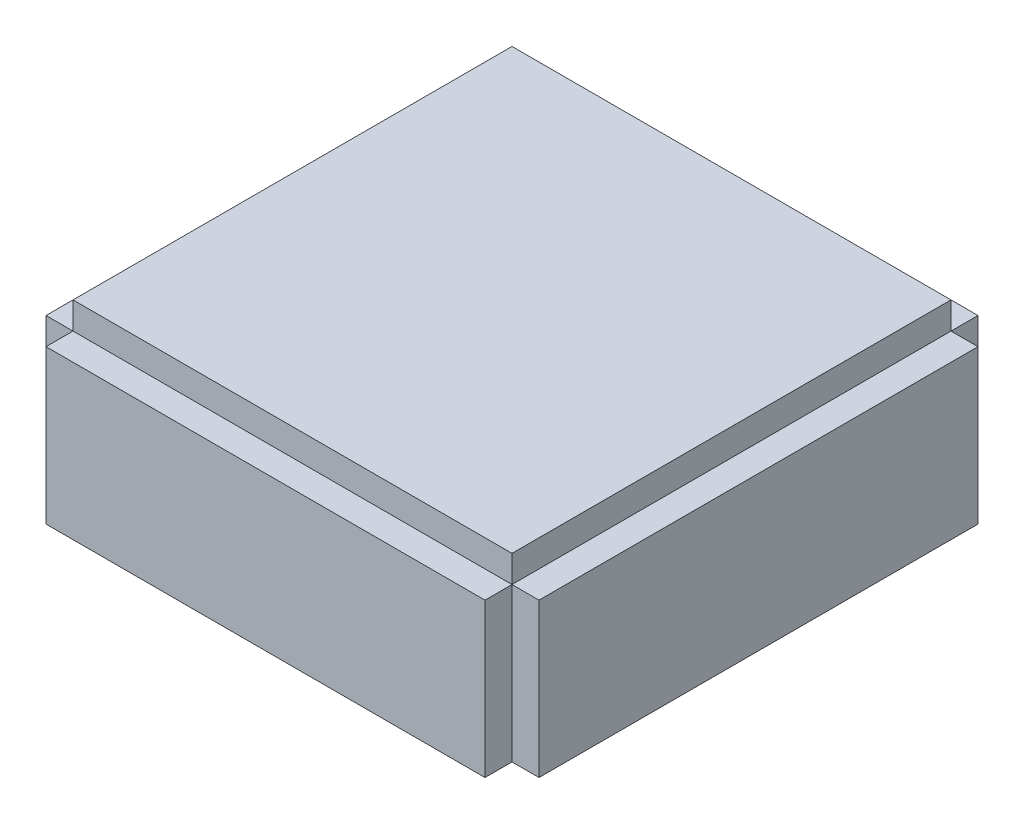
ISO-10303-21;
HEADER;
FILE_DESCRIPTION(('STEP AP214'),'2;1');
FILE_NAME('part.step','',(''),(''),'','','');
FILE_SCHEMA(('AUTOMOTIVE_DESIGN { 1 0 10303 214 1 1 1 1 }'));
ENDSEC;
DATA;
#1=APPLICATION_CONTEXT('core data for automotive mechanical design processes');
#2=APPLICATION_PROTOCOL_DEFINITION('international standard','automotive_design',2000,#1);
#3=PRODUCT_CONTEXT('',#1,'mechanical');
#4=PRODUCT('Part','Part','',(#3));
#5=PRODUCT_RELATED_PRODUCT_CATEGORY('part','',(#4));
#6=PRODUCT_DEFINITION_FORMATION('','',#4);
#7=PRODUCT_DEFINITION_CONTEXT('part definition',#1,'design');
#8=PRODUCT_DEFINITION('design','',#6,#7);
#9=PRODUCT_DEFINITION_SHAPE('','',#8);
#10=(LENGTH_UNIT() NAMED_UNIT(*) SI_UNIT(.MILLI.,.METRE.));
#11=(NAMED_UNIT(*) PLANE_ANGLE_UNIT() SI_UNIT($,.RADIAN.));
#12=(NAMED_UNIT(*) SI_UNIT($,.STERADIAN.) SOLID_ANGLE_UNIT());
#13=UNCERTAINTY_MEASURE_WITH_UNIT(LENGTH_MEASURE(1.E-05),#10,'distance_accuracy_value','');
#14=(GEOMETRIC_REPRESENTATION_CONTEXT(3) GLOBAL_UNCERTAINTY_ASSIGNED_CONTEXT((#13)) GLOBAL_UNIT_ASSIGNED_CONTEXT((#10,
#11,#12)) REPRESENTATION_CONTEXT('',''));
#15=CARTESIAN_POINT('',(0.,0.,0.));
#16=DIRECTION('',(0.,0.,1.));
#17=DIRECTION('',(1.,0.,0.));
#18=AXIS2_PLACEMENT_3D('',#15,#16,#17);
#19=CARTESIAN_POINT('',(0.,-23.114,82.5499999999999));
#20=DIRECTION('',(0.,0.,-1.));
#21=DIRECTION('',(-1.,0.,0.));
#22=AXIS2_PLACEMENT_3D('',#19,#20,#21);
#23=PLANE('',#22);
#24=DIRECTION('',(-1.,0.,0.));
#25=VECTOR('',#24,1.);
#26=CARTESIAN_POINT('',(0.,0.,82.5499999999999));
#27=LINE('',#26,#25);
#28=CARTESIAN_POINT('',(-2.09799999999999,0.,82.5499999999999));
#29=VERTEX_POINT('',#28);
#30=CARTESIAN_POINT('',(-68.138,0.,82.5499999999999));
#31=VERTEX_POINT('',#30);
#32=EDGE_CURVE('E110',#29,#31,#27,.T.);
#33=ORIENTED_EDGE('',*,*,#32,.F.);
#34=DIRECTION('',(0.,1.,0.));
#35=VECTOR('',#34,1.);
#36=CARTESIAN_POINT('',(-2.09799999999999,-23.114,82.5499999999999));
#37=LINE('',#36,#35);
#38=CARTESIAN_POINT('',(-2.09799999999999,-23.114,82.5499999999999));
#39=VERTEX_POINT('',#38);
#40=EDGE_CURVE('E12',#39,#29,#37,.T.);
#41=ORIENTED_EDGE('',*,*,#40,.F.);
#42=DIRECTION('',(-1.,0.,0.));
#43=VECTOR('',#42,1.);
#44=CARTESIAN_POINT('',(0.,-23.114,82.5499999999999));
#45=LINE('',#44,#43);
#46=CARTESIAN_POINT('',(-68.138,-23.114,82.5499999999999));
#47=VERTEX_POINT('',#46);
#48=EDGE_CURVE('E98',#39,#47,#45,.T.);
#49=ORIENTED_EDGE('',*,*,#48,.T.);
#50=DIRECTION('',(0.,1.,0.));
#51=VECTOR('',#50,1.);
#52=CARTESIAN_POINT('',(-68.138,-23.114,82.5499999999999));
#53=LINE('',#52,#51);
#54=EDGE_CURVE('E87',#47,#31,#53,.T.);
#55=ORIENTED_EDGE('',*,*,#54,.T.);
#56=EDGE_LOOP('',(#33,#41,#49,#55));
#57=FACE_BOUND('',#56,.T.);
#58=ADVANCED_FACE('F48',(#57),#23,.T.);
#59=CARTESIAN_POINT('',(-2.09799999999999,-23.114,0.));
#60=DIRECTION('',(-1.,0.,0.));
#61=DIRECTION('',(0.,0.,1.));
#62=AXIS2_PLACEMENT_3D('',#59,#60,#61);
#63=PLANE('',#62);
#64=DIRECTION('',(0.,0.,1.));
#65=VECTOR('',#64,1.);
#66=CARTESIAN_POINT('',(-2.09799999999999,0.,0.));
#67=LINE('',#66,#65);
#68=CARTESIAN_POINT('',(-2.09799999999999,0.,86.6139999999999));
#69=VERTEX_POINT('',#68);
#70=EDGE_CURVE('E103',#29,#69,#67,.T.);
#71=ORIENTED_EDGE('',*,*,#70,.T.);
#72=DIRECTION('',(0.,1.,0.));
#73=VECTOR('',#72,1.);
#74=CARTESIAN_POINT('',(-2.09799999999999,-23.114,86.6139999999999));
#75=LINE('',#74,#73);
#76=CARTESIAN_POINT('',(-2.09799999999999,-23.114,86.6139999999999));
#77=VERTEX_POINT('',#76);
#78=EDGE_CURVE('E56',#77,#69,#75,.T.);
#79=ORIENTED_EDGE('',*,*,#78,.F.);
#80=DIRECTION('',(0.,0.,1.));
#81=VECTOR('',#80,1.);
#82=CARTESIAN_POINT('',(-2.09799999999999,-23.114,0.));
#83=LINE('',#82,#81);
#84=EDGE_CURVE('E93',#39,#77,#83,.T.);
#85=ORIENTED_EDGE('',*,*,#84,.F.);
#86=ORIENTED_EDGE('',*,*,#40,.T.);
#87=EDGE_LOOP('',(#71,#79,#85,#86));
#88=FACE_BOUND('',#87,.T.);
#89=ADVANCED_FACE('F101',(#88),#63,.F.);
#90=CARTESIAN_POINT('',(0.,-23.114,86.6139999999999));
#91=DIRECTION('',(0.,0.,-1.));
#92=DIRECTION('',(-1.,0.,0.));
#93=AXIS2_PLACEMENT_3D('',#90,#91,#92);
#94=PLANE('',#93);
#95=DIRECTION('',(-1.,0.,0.));
#96=VECTOR('',#95,1.);
#97=CARTESIAN_POINT('',(0.,0.,86.6139999999999));
#98=LINE('',#97,#96);
#99=CARTESIAN_POINT('',(-68.138,0.,86.6139999999999));
#100=VERTEX_POINT('',#99);
#101=EDGE_CURVE('E80',#69,#100,#98,.T.);
#102=ORIENTED_EDGE('',*,*,#101,.T.);
#103=DIRECTION('',(0.,1.,0.));
#104=VECTOR('',#103,1.);
#105=CARTESIAN_POINT('',(-68.138,-23.114,86.6139999999999));
#106=LINE('',#105,#104);
#107=CARTESIAN_POINT('',(-68.138,-23.114,86.6139999999999));
#108=VERTEX_POINT('',#107);
#109=EDGE_CURVE('E104',#108,#100,#106,.T.);
#110=ORIENTED_EDGE('',*,*,#109,.F.);
#111=DIRECTION('',(-1.,0.,0.));
#112=VECTOR('',#111,1.);
#113=CARTESIAN_POINT('',(0.,-23.114,86.6139999999999));
#114=LINE('',#113,#112);
#115=EDGE_CURVE('E97',#77,#108,#114,.T.);
#116=ORIENTED_EDGE('',*,*,#115,.F.);
#117=ORIENTED_EDGE('',*,*,#78,.T.);
#118=EDGE_LOOP('',(#102,#110,#116,#117));
#119=FACE_BOUND('',#118,.T.);
#120=ADVANCED_FACE('F105',(#119),#94,.F.);
#121=CARTESIAN_POINT('',(-68.138,-23.114,0.));
#122=DIRECTION('',(1.,0.,0.));
#123=DIRECTION('',(0.,0.,-1.));
#124=AXIS2_PLACEMENT_3D('',#121,#122,#123);
#125=PLANE('',#124);
#126=DIRECTION('',(0.,0.,-1.));
#127=VECTOR('',#126,1.);
#128=CARTESIAN_POINT('',(-68.138,0.,0.));
#129=LINE('',#128,#127);
#130=EDGE_CURVE('E115',#100,#31,#129,.T.);
#131=ORIENTED_EDGE('',*,*,#130,.T.);
#132=ORIENTED_EDGE('',*,*,#54,.F.);
#133=DIRECTION('',(0.,0.,-1.));
#134=VECTOR('',#133,1.);
#135=CARTESIAN_POINT('',(-68.138,-23.114,0.));
#136=LINE('',#135,#134);
#137=EDGE_CURVE('E64',#108,#47,#136,.T.);
#138=ORIENTED_EDGE('',*,*,#137,.F.);
#139=ORIENTED_EDGE('',*,*,#109,.T.);
#140=EDGE_LOOP('',(#131,#132,#138,#139));
#141=FACE_BOUND('',#140,.T.);
#142=ADVANCED_FACE('F120',(#141),#125,.F.);
#143=CARTESIAN_POINT('',(0.,-23.114,0.));
#144=DIRECTION('',(0.,-1.,0.));
#145=DIRECTION('',(0.,0.,-1.));
#146=AXIS2_PLACEMENT_3D('',#143,#144,#145);
#147=PLANE('',#146);
#148=ORIENTED_EDGE('',*,*,#48,.F.);
#149=ORIENTED_EDGE('',*,*,#84,.T.);
#150=ORIENTED_EDGE('',*,*,#115,.T.);
#151=ORIENTED_EDGE('',*,*,#137,.T.);
#152=EDGE_LOOP('',(#148,#149,#150,#151));
#153=FACE_BOUND('',#152,.T.);
#154=ADVANCED_FACE('F95',(#153),#147,.T.);
#155=CARTESIAN_POINT('',(0.,0.,0.));
#156=DIRECTION('',(0.,-1.,0.));
#157=DIRECTION('',(0.,0.,-1.));
#158=AXIS2_PLACEMENT_3D('',#155,#156,#157);
#159=PLANE('',#158);
#160=ORIENTED_EDGE('',*,*,#32,.T.);
#161=ORIENTED_EDGE('',*,*,#130,.F.);
#162=ORIENTED_EDGE('',*,*,#101,.F.);
#163=ORIENTED_EDGE('',*,*,#70,.F.);
#164=EDGE_LOOP('',(#160,#161,#162,#163));
#165=FACE_BOUND('',#164,.T.);
#166=ADVANCED_FACE('F122',(#165),#159,.F.);
#167=CLOSED_SHELL('',(#58,#89,#120,#142,#154,#166));
#168=MANIFOLD_SOLID_BREP('B2',#167);
#169=CARTESIAN_POINT('',(1.96600000000004,-23.114,0.));
#170=DIRECTION('',(1.,0.,0.));
#171=DIRECTION('',(0.,0.,-1.));
#172=AXIS2_PLACEMENT_3D('',#169,#170,#171);
#173=PLANE('',#172);
#174=DIRECTION('',(0.,0.,-1.));
#175=VECTOR('',#174,1.);
#176=CARTESIAN_POINT('',(1.96600000000004,0.,0.));
#177=LINE('',#176,#175);
#178=CARTESIAN_POINT('',(1.96600000000003,0.,152.654));
#179=VERTEX_POINT('',#178);
#180=CARTESIAN_POINT('',(1.96600000000003,0.,86.6139999999999));
#181=VERTEX_POINT('',#180);
#182=EDGE_CURVE('E250',#179,#181,#177,.T.);
#183=ORIENTED_EDGE('',*,*,#182,.F.);
#184=DIRECTION('',(0.,1.,0.));
#185=VECTOR('',#184,1.);
#186=CARTESIAN_POINT('',(1.96600000000003,-23.114,152.654));
#187=LINE('',#186,#185);
#188=CARTESIAN_POINT('',(1.96600000000003,-23.114,152.654));
#189=VERTEX_POINT('',#188);
#190=EDGE_CURVE('E46',#189,#179,#187,.T.);
#191=ORIENTED_EDGE('',*,*,#190,.F.);
#192=DIRECTION('',(0.,0.,-1.));
#193=VECTOR('',#192,1.);
#194=CARTESIAN_POINT('',(1.96600000000004,-23.114,0.));
#195=LINE('',#194,#193);
#196=CARTESIAN_POINT('',(1.96600000000003,-23.114,86.6139999999999));
#197=VERTEX_POINT('',#196);
#198=EDGE_CURVE('E238',#189,#197,#195,.T.);
#199=ORIENTED_EDGE('',*,*,#198,.T.);
#200=DIRECTION('',(0.,1.,0.));
#201=VECTOR('',#200,1.);
#202=CARTESIAN_POINT('',(1.96600000000003,-23.114,86.6139999999999));
#203=LINE('',#202,#201);
#204=EDGE_CURVE('E227',#197,#181,#203,.T.);
#205=ORIENTED_EDGE('',*,*,#204,.T.);
#206=EDGE_LOOP('',(#183,#191,#199,#205));
#207=FACE_BOUND('',#206,.T.);
#208=ADVANCED_FACE('F188',(#207),#173,.T.);
#209=CARTESIAN_POINT('',(-1.8330880159333E-13,-23.114,152.654));
#210=DIRECTION('',(0.,0.,-1.));
#211=DIRECTION('',(-1.,0.,0.));
#212=AXIS2_PLACEMENT_3D('',#209,#210,#211);
#213=PLANE('',#212);
#214=DIRECTION('',(-1.,0.,0.));
#215=VECTOR('',#214,1.);
#216=CARTESIAN_POINT('',(-1.8330880159333E-13,0.,152.654));
#217=LINE('',#216,#215);
#218=CARTESIAN_POINT('',(-2.09799999999997,0.,152.654));
#219=VERTEX_POINT('',#218);
#220=EDGE_CURVE('E243',#179,#219,#217,.T.);
#221=ORIENTED_EDGE('',*,*,#220,.T.);
#222=DIRECTION('',(0.,1.,0.));
#223=VECTOR('',#222,1.);
#224=CARTESIAN_POINT('',(-2.09799999999997,-23.114,152.654));
#225=LINE('',#224,#223);
#226=CARTESIAN_POINT('',(-2.09799999999997,-23.114,152.654));
#227=VERTEX_POINT('',#226);
#228=EDGE_CURVE('E196',#227,#219,#225,.T.);
#229=ORIENTED_EDGE('',*,*,#228,.F.);
#230=DIRECTION('',(-1.,0.,0.));
#231=VECTOR('',#230,1.);
#232=CARTESIAN_POINT('',(-1.8330880159333E-13,-23.114,152.654));
#233=LINE('',#232,#231);
#234=EDGE_CURVE('E233',#189,#227,#233,.T.);
#235=ORIENTED_EDGE('',*,*,#234,.F.);
#236=ORIENTED_EDGE('',*,*,#190,.T.);
#237=EDGE_LOOP('',(#221,#229,#235,#236));
#238=FACE_BOUND('',#237,.T.);
#239=ADVANCED_FACE('F241',(#238),#213,.F.);
#240=CARTESIAN_POINT('',(-2.09799999999996,-23.114,0.));
#241=DIRECTION('',(1.,0.,0.));
#242=DIRECTION('',(0.,0.,-1.));
#243=AXIS2_PLACEMENT_3D('',#240,#241,#242);
#244=PLANE('',#243);
#245=DIRECTION('',(0.,0.,-1.));
#246=VECTOR('',#245,1.);
#247=CARTESIAN_POINT('',(-2.09799999999996,0.,0.));
#248=LINE('',#247,#246);
#249=CARTESIAN_POINT('',(-2.09799999999999,0.,86.6139999999999));
#250=VERTEX_POINT('',#249);
#251=EDGE_CURVE('E220',#219,#250,#248,.T.);
#252=ORIENTED_EDGE('',*,*,#251,.T.);
#253=DIRECTION('',(0.,1.,0.));
#254=VECTOR('',#253,1.);
#255=CARTESIAN_POINT('',(-2.09799999999999,-23.114,86.6139999999999));
#256=LINE('',#255,#254);
#257=CARTESIAN_POINT('',(-2.09799999999999,-23.114,86.6139999999999));
#258=VERTEX_POINT('',#257);
#259=EDGE_CURVE('E244',#258,#250,#256,.T.);
#260=ORIENTED_EDGE('',*,*,#259,.F.);
#261=DIRECTION('',(0.,0.,-1.));
#262=VECTOR('',#261,1.);
#263=CARTESIAN_POINT('',(-2.09799999999996,-23.114,0.));
#264=LINE('',#263,#262);
#265=EDGE_CURVE('E237',#227,#258,#264,.T.);
#266=ORIENTED_EDGE('',*,*,#265,.F.);
#267=ORIENTED_EDGE('',*,*,#228,.T.);
#268=EDGE_LOOP('',(#252,#260,#266,#267));
#269=FACE_BOUND('',#268,.T.);
#270=ADVANCED_FACE('F245',(#269),#244,.F.);
#271=CARTESIAN_POINT('',(0.,-23.114,86.6139999999999));
#272=DIRECTION('',(0.,0.,1.));
#273=DIRECTION('',(1.,0.,0.));
#274=AXIS2_PLACEMENT_3D('',#271,#272,#273);
#275=PLANE('',#274);
#276=DIRECTION('',(1.,0.,0.));
#277=VECTOR('',#276,1.);
#278=CARTESIAN_POINT('',(0.,0.,86.6139999999999));
#279=LINE('',#278,#277);
#280=EDGE_CURVE('E255',#250,#181,#279,.T.);
#281=ORIENTED_EDGE('',*,*,#280,.T.);
#282=ORIENTED_EDGE('',*,*,#204,.F.);
#283=DIRECTION('',(1.,0.,0.));
#284=VECTOR('',#283,1.);
#285=CARTESIAN_POINT('',(0.,-23.114,86.6139999999999));
#286=LINE('',#285,#284);
#287=EDGE_CURVE('E204',#258,#197,#286,.T.);
#288=ORIENTED_EDGE('',*,*,#287,.F.);
#289=ORIENTED_EDGE('',*,*,#259,.T.);
#290=EDGE_LOOP('',(#281,#282,#288,#289));
#291=FACE_BOUND('',#290,.T.);
#292=ADVANCED_FACE('F260',(#291),#275,.F.);
#293=CARTESIAN_POINT('',(0.,-23.114,0.));
#294=DIRECTION('',(0.,-1.,0.));
#295=DIRECTION('',(0.,0.,-1.));
#296=AXIS2_PLACEMENT_3D('',#293,#294,#295);
#297=PLANE('',#296);
#298=ORIENTED_EDGE('',*,*,#198,.F.);
#299=ORIENTED_EDGE('',*,*,#234,.T.);
#300=ORIENTED_EDGE('',*,*,#265,.T.);
#301=ORIENTED_EDGE('',*,*,#287,.T.);
#302=EDGE_LOOP('',(#298,#299,#300,#301));
#303=FACE_BOUND('',#302,.T.);
#304=ADVANCED_FACE('F235',(#303),#297,.T.);
#305=CARTESIAN_POINT('',(0.,0.,0.));
#306=DIRECTION('',(0.,-1.,0.));
#307=DIRECTION('',(0.,0.,-1.));
#308=AXIS2_PLACEMENT_3D('',#305,#306,#307);
#309=PLANE('',#308);
#310=ORIENTED_EDGE('',*,*,#182,.T.);
#311=ORIENTED_EDGE('',*,*,#280,.F.);
#312=ORIENTED_EDGE('',*,*,#251,.F.);
#313=ORIENTED_EDGE('',*,*,#220,.F.);
#314=EDGE_LOOP('',(#310,#311,#312,#313));
#315=FACE_BOUND('',#314,.T.);
#316=ADVANCED_FACE('F262',(#315),#309,.F.);
#317=CLOSED_SHELL('',(#208,#239,#270,#292,#304,#316));
#318=MANIFOLD_SOLID_BREP('B6',#317);
#319=CARTESIAN_POINT('',(0.,-23.114,156.718));
#320=DIRECTION('',(0.,0.,1.));
#321=DIRECTION('',(1.,0.,0.));
#322=AXIS2_PLACEMENT_3D('',#319,#320,#321);
#323=PLANE('',#322);
#324=DIRECTION('',(1.,0.,0.));
#325=VECTOR('',#324,1.);
#326=CARTESIAN_POINT('',(0.,0.,156.718));
#327=LINE('',#326,#325);
#328=CARTESIAN_POINT('',(-68.138,0.,156.718));
#329=VERTEX_POINT('',#328);
#330=CARTESIAN_POINT('',(-2.09799999999997,0.,156.718));
#331=VERTEX_POINT('',#330);
#332=EDGE_CURVE('E390',#329,#331,#327,.T.);
#333=ORIENTED_EDGE('',*,*,#332,.F.);
#334=DIRECTION('',(0.,1.,0.));
#335=VECTOR('',#334,1.);
#336=CARTESIAN_POINT('',(-68.138,-23.114,156.718));
#337=LINE('',#336,#335);
#338=CARTESIAN_POINT('',(-68.138,-23.114,156.718));
#339=VERTEX_POINT('',#338);
#340=EDGE_CURVE('E186',#339,#329,#337,.T.);
#341=ORIENTED_EDGE('',*,*,#340,.F.);
#342=DIRECTION('',(1.,0.,0.));
#343=VECTOR('',#342,1.);
#344=CARTESIAN_POINT('',(0.,-23.114,156.718));
#345=LINE('',#344,#343);
#346=CARTESIAN_POINT('',(-2.09799999999997,-23.114,156.718));
#347=VERTEX_POINT('',#346);
#348=EDGE_CURVE('E378',#339,#347,#345,.T.);
#349=ORIENTED_EDGE('',*,*,#348,.T.);
#350=DIRECTION('',(0.,1.,0.));
#351=VECTOR('',#350,1.);
#352=CARTESIAN_POINT('',(-2.09799999999997,-23.114,156.718));
#353=LINE('',#352,#351);
#354=EDGE_CURVE('E367',#347,#331,#353,.T.);
#355=ORIENTED_EDGE('',*,*,#354,.T.);
#356=EDGE_LOOP('',(#333,#341,#349,#355));
#357=FACE_BOUND('',#356,.T.);
#358=ADVANCED_FACE('F328',(#357),#323,.T.);
#359=CARTESIAN_POINT('',(-68.138,-23.114,0.));
#360=DIRECTION('',(1.,0.,0.));
#361=DIRECTION('',(0.,0.,-1.));
#362=AXIS2_PLACEMENT_3D('',#359,#360,#361);
#363=PLANE('',#362);
#364=DIRECTION('',(0.,0.,-1.));
#365=VECTOR('',#364,1.);
#366=CARTESIAN_POINT('',(-68.138,0.,0.));
#367=LINE('',#366,#365);
#368=CARTESIAN_POINT('',(-68.138,0.,152.654));
#369=VERTEX_POINT('',#368);
#370=EDGE_CURVE('E383',#329,#369,#367,.T.);
#371=ORIENTED_EDGE('',*,*,#370,.T.);
#372=DIRECTION('',(0.,1.,0.));
#373=VECTOR('',#372,1.);
#374=CARTESIAN_POINT('',(-68.138,-23.114,152.654));
#375=LINE('',#374,#373);
#376=CARTESIAN_POINT('',(-68.138,-23.114,152.654));
#377=VERTEX_POINT('',#376);
#378=EDGE_CURVE('E336',#377,#369,#375,.T.);
#379=ORIENTED_EDGE('',*,*,#378,.F.);
#380=DIRECTION('',(0.,0.,-1.));
#381=VECTOR('',#380,1.);
#382=CARTESIAN_POINT('',(-68.138,-23.114,0.));
#383=LINE('',#382,#381);
#384=EDGE_CURVE('E373',#339,#377,#383,.T.);
#385=ORIENTED_EDGE('',*,*,#384,.F.);
#386=ORIENTED_EDGE('',*,*,#340,.T.);
#387=EDGE_LOOP('',(#371,#379,#385,#386));
#388=FACE_BOUND('',#387,.T.);
#389=ADVANCED_FACE('F381',(#388),#363,.F.);
#390=CARTESIAN_POINT('',(0.,-23.114,152.654));
#391=DIRECTION('',(0.,0.,1.));
#392=DIRECTION('',(1.,0.,0.));
#393=AXIS2_PLACEMENT_3D('',#390,#391,#392);
#394=PLANE('',#393);
#395=DIRECTION('',(1.,0.,0.));
#396=VECTOR('',#395,1.);
#397=CARTESIAN_POINT('',(0.,0.,152.654));
#398=LINE('',#397,#396);
#399=CARTESIAN_POINT('',(-2.09799999999997,0.,152.654));
#400=VERTEX_POINT('',#399);
#401=EDGE_CURVE('E360',#369,#400,#398,.T.);
#402=ORIENTED_EDGE('',*,*,#401,.T.);
#403=DIRECTION('',(0.,1.,0.));
#404=VECTOR('',#403,1.);
#405=CARTESIAN_POINT('',(-2.09799999999997,-23.114,152.654));
#406=LINE('',#405,#404);
#407=CARTESIAN_POINT('',(-2.09799999999997,-23.114,152.654));
#408=VERTEX_POINT('',#407);
#409=EDGE_CURVE('E384',#408,#400,#406,.T.);
#410=ORIENTED_EDGE('',*,*,#409,.F.);
#411=DIRECTION('',(1.,0.,0.));
#412=VECTOR('',#411,1.);
#413=CARTESIAN_POINT('',(0.,-23.114,152.654));
#414=LINE('',#413,#412);
#415=EDGE_CURVE('E377',#377,#408,#414,.T.);
#416=ORIENTED_EDGE('',*,*,#415,.F.);
#417=ORIENTED_EDGE('',*,*,#378,.T.);
#418=EDGE_LOOP('',(#402,#410,#416,#417));
#419=FACE_BOUND('',#418,.T.);
#420=ADVANCED_FACE('F385',(#419),#394,.F.);
#421=CARTESIAN_POINT('',(-2.09799999999997,-23.114,0.));
#422=DIRECTION('',(-1.,0.,0.));
#423=DIRECTION('',(0.,0.,1.));
#424=AXIS2_PLACEMENT_3D('',#421,#422,#423);
#425=PLANE('',#424);
#426=DIRECTION('',(0.,0.,1.));
#427=VECTOR('',#426,1.);
#428=CARTESIAN_POINT('',(-2.09799999999997,0.,0.));
#429=LINE('',#428,#427);
#430=EDGE_CURVE('E395',#400,#331,#429,.T.);
#431=ORIENTED_EDGE('',*,*,#430,.T.);
#432=ORIENTED_EDGE('',*,*,#354,.F.);
#433=DIRECTION('',(0.,0.,1.));
#434=VECTOR('',#433,1.);
#435=CARTESIAN_POINT('',(-2.09799999999997,-23.114,0.));
#436=LINE('',#435,#434);
#437=EDGE_CURVE('E344',#408,#347,#436,.T.);
#438=ORIENTED_EDGE('',*,*,#437,.F.);
#439=ORIENTED_EDGE('',*,*,#409,.T.);
#440=EDGE_LOOP('',(#431,#432,#438,#439));
#441=FACE_BOUND('',#440,.T.);
#442=ADVANCED_FACE('F400',(#441),#425,.F.);
#443=CARTESIAN_POINT('',(0.,-23.114,0.));
#444=DIRECTION('',(0.,-1.,0.));
#445=DIRECTION('',(0.,0.,-1.));
#446=AXIS2_PLACEMENT_3D('',#443,#444,#445);
#447=PLANE('',#446);
#448=ORIENTED_EDGE('',*,*,#348,.F.);
#449=ORIENTED_EDGE('',*,*,#384,.T.);
#450=ORIENTED_EDGE('',*,*,#415,.T.);
#451=ORIENTED_EDGE('',*,*,#437,.T.);
#452=EDGE_LOOP('',(#448,#449,#450,#451));
#453=FACE_BOUND('',#452,.T.);
#454=ADVANCED_FACE('F375',(#453),#447,.T.);
#455=CARTESIAN_POINT('',(0.,0.,0.));
#456=DIRECTION('',(0.,-1.,0.));
#457=DIRECTION('',(0.,0.,-1.));
#458=AXIS2_PLACEMENT_3D('',#455,#456,#457);
#459=PLANE('',#458);
#460=ORIENTED_EDGE('',*,*,#332,.T.);
#461=ORIENTED_EDGE('',*,*,#430,.F.);
#462=ORIENTED_EDGE('',*,*,#401,.F.);
#463=ORIENTED_EDGE('',*,*,#370,.F.);
#464=EDGE_LOOP('',(#460,#461,#462,#463));
#465=FACE_BOUND('',#464,.T.);
#466=ADVANCED_FACE('F402',(#465),#459,.F.);
#467=CLOSED_SHELL('',(#358,#389,#420,#442,#454,#466));
#468=MANIFOLD_SOLID_BREP('B40',#467);
#469=CARTESIAN_POINT('',(1.8330880159333E-13,-23.114,152.654));
#470=DIRECTION('',(0.,0.,-1.));
#471=DIRECTION('',(-1.,0.,0.));
#472=AXIS2_PLACEMENT_3D('',#469,#470,#471);
#473=PLANE('',#472);
#474=DIRECTION('',(-1.,0.,0.));
#475=VECTOR('',#474,1.);
#476=CARTESIAN_POINT('',(1.8330880159333E-13,0.,152.654));
#477=LINE('',#476,#475);
#478=CARTESIAN_POINT('',(-68.138,0.,152.654));
#479=VERTEX_POINT('',#478);
#480=CARTESIAN_POINT('',(-72.202,0.,152.654));
#481=VERTEX_POINT('',#480);
#482=EDGE_CURVE('E530',#479,#481,#477,.T.);
#483=ORIENTED_EDGE('',*,*,#482,.T.);
#484=DIRECTION('',(0.,1.,0.));
#485=VECTOR('',#484,1.);
#486=CARTESIAN_POINT('',(-72.202,-23.114,152.654));
#487=LINE('',#486,#485);
#488=CARTESIAN_POINT('',(-72.202,-23.114,152.654));
#489=VERTEX_POINT('',#488);
#490=EDGE_CURVE('E326',#489,#481,#487,.T.);
#491=ORIENTED_EDGE('',*,*,#490,.F.);
#492=DIRECTION('',(-1.,0.,0.));
#493=VECTOR('',#492,1.);
#494=CARTESIAN_POINT('',(1.8330880159333E-13,-23.114,152.654));
#495=LINE('',#494,#493);
#496=CARTESIAN_POINT('',(-68.138,-23.114,152.654));
#497=VERTEX_POINT('',#496);
#498=EDGE_CURVE('E516',#497,#489,#495,.T.);
#499=ORIENTED_EDGE('',*,*,#498,.F.);
#500=DIRECTION('',(0.,1.,0.));
#501=VECTOR('',#500,1.);
#502=CARTESIAN_POINT('',(-68.138,-23.114,152.654));
#503=LINE('',#502,#501);
#504=EDGE_CURVE('E483',#497,#479,#503,.T.);
#505=ORIENTED_EDGE('',*,*,#504,.T.);
#506=EDGE_LOOP('',(#483,#491,#499,#505));
#507=FACE_BOUND('',#506,.T.);
#508=ADVANCED_FACE('F467',(#507),#473,.F.);
#509=CARTESIAN_POINT('',(-72.202,-23.114,0.));
#510=DIRECTION('',(1.,0.,0.));
#511=DIRECTION('',(0.,0.,-1.));
#512=AXIS2_PLACEMENT_3D('',#509,#510,#511);
#513=PLANE('',#512);
#514=DIRECTION('',(0.,0.,-1.));
#515=VECTOR('',#514,1.);
#516=CARTESIAN_POINT('',(-72.202,0.,0.));
#517=LINE('',#516,#515);
#518=CARTESIAN_POINT('',(-72.202,0.,86.6139999999999));
#519=VERTEX_POINT('',#518);
#520=EDGE_CURVE('E521',#481,#519,#517,.T.);
#521=ORIENTED_EDGE('',*,*,#520,.T.);
#522=DIRECTION('',(0.,1.,0.));
#523=VECTOR('',#522,1.);
#524=CARTESIAN_POINT('',(-72.202,-23.114,86.6139999999999));
#525=LINE('',#524,#523);
#526=CARTESIAN_POINT('',(-72.202,-23.114,86.6139999999999));
#527=VERTEX_POINT('',#526);
#528=EDGE_CURVE('E475',#527,#519,#525,.T.);
#529=ORIENTED_EDGE('',*,*,#528,.F.);
#530=DIRECTION('',(0.,0.,-1.));
#531=VECTOR('',#530,1.);
#532=CARTESIAN_POINT('',(-72.202,-23.114,0.));
#533=LINE('',#532,#531);
#534=EDGE_CURVE('E509',#489,#527,#533,.T.);
#535=ORIENTED_EDGE('',*,*,#534,.F.);
#536=ORIENTED_EDGE('',*,*,#490,.T.);
#537=EDGE_LOOP('',(#521,#529,#535,#536));
#538=FACE_BOUND('',#537,.T.);
#539=ADVANCED_FACE('F520',(#538),#513,.F.);
#540=CARTESIAN_POINT('',(0.,-23.114,86.6139999999999));
#541=DIRECTION('',(0.,0.,1.));
#542=DIRECTION('',(1.,0.,0.));
#543=AXIS2_PLACEMENT_3D('',#540,#541,#542);
#544=PLANE('',#543);
#545=DIRECTION('',(1.,0.,0.));
#546=VECTOR('',#545,1.);
#547=CARTESIAN_POINT('',(0.,0.,86.6139999999999));
#548=LINE('',#547,#546);
#549=CARTESIAN_POINT('',(-68.138,0.,86.6139999999999));
#550=VERTEX_POINT('',#549);
#551=EDGE_CURVE('E533',#519,#550,#548,.T.);
#552=ORIENTED_EDGE('',*,*,#551,.T.);
#553=DIRECTION('',(0.,1.,0.));
#554=VECTOR('',#553,1.);
#555=CARTESIAN_POINT('',(-68.138,-23.114,86.6139999999999));
#556=LINE('',#555,#554);
#557=CARTESIAN_POINT('',(-68.138,-23.114,86.6139999999999));
#558=VERTEX_POINT('',#557);
#559=EDGE_CURVE('E498',#558,#550,#556,.T.);
#560=ORIENTED_EDGE('',*,*,#559,.F.);
#561=DIRECTION('',(1.,0.,0.));
#562=VECTOR('',#561,1.);
#563=CARTESIAN_POINT('',(0.,-23.114,86.6139999999999));
#564=LINE('',#563,#562);
#565=EDGE_CURVE('E515',#527,#558,#564,.T.);
#566=ORIENTED_EDGE('',*,*,#565,.F.);
#567=ORIENTED_EDGE('',*,*,#528,.T.);
#568=EDGE_LOOP('',(#552,#560,#566,#567));
#569=FACE_BOUND('',#568,.T.);
#570=ADVANCED_FACE('F524',(#569),#544,.F.);
#571=CARTESIAN_POINT('',(-68.138,-23.114,0.));
#572=DIRECTION('',(1.,0.,0.));
#573=DIRECTION('',(0.,0.,-1.));
#574=AXIS2_PLACEMENT_3D('',#571,#572,#573);
#575=PLANE('',#574);
#576=DIRECTION('',(0.,0.,-1.));
#577=VECTOR('',#576,1.);
#578=CARTESIAN_POINT('',(-68.138,0.,0.));
#579=LINE('',#578,#577);
#580=EDGE_CURVE('E535',#479,#550,#579,.T.);
#581=ORIENTED_EDGE('',*,*,#580,.F.);
#582=ORIENTED_EDGE('',*,*,#504,.F.);
#583=DIRECTION('',(0.,0.,-1.));
#584=VECTOR('',#583,1.);
#585=CARTESIAN_POINT('',(-68.138,-23.114,0.));
#586=LINE('',#585,#584);
#587=EDGE_CURVE('E525',#497,#558,#586,.T.);
#588=ORIENTED_EDGE('',*,*,#587,.T.);
#589=ORIENTED_EDGE('',*,*,#559,.T.);
#590=EDGE_LOOP('',(#581,#582,#588,#589));
#591=FACE_BOUND('',#590,.T.);
#592=ADVANCED_FACE('F541',(#591),#575,.T.);
#593=CARTESIAN_POINT('',(0.,-23.114,0.));
#594=DIRECTION('',(0.,-1.,0.));
#595=DIRECTION('',(0.,0.,-1.));
#596=AXIS2_PLACEMENT_3D('',#593,#594,#595);
#597=PLANE('',#596);
#598=ORIENTED_EDGE('',*,*,#498,.T.);
#599=ORIENTED_EDGE('',*,*,#534,.T.);
#600=ORIENTED_EDGE('',*,*,#565,.T.);
#601=ORIENTED_EDGE('',*,*,#587,.F.);
#602=EDGE_LOOP('',(#598,#599,#600,#601));
#603=FACE_BOUND('',#602,.T.);
#604=ADVANCED_FACE('F512',(#603),#597,.T.);
#605=CARTESIAN_POINT('',(0.,0.,0.));
#606=DIRECTION('',(0.,-1.,0.));
#607=DIRECTION('',(0.,0.,-1.));
#608=AXIS2_PLACEMENT_3D('',#605,#606,#607);
#609=PLANE('',#608);
#610=ORIENTED_EDGE('',*,*,#482,.F.);
#611=ORIENTED_EDGE('',*,*,#580,.T.);
#612=ORIENTED_EDGE('',*,*,#551,.F.);
#613=ORIENTED_EDGE('',*,*,#520,.F.);
#614=EDGE_LOOP('',(#610,#611,#612,#613));
#615=FACE_BOUND('',#614,.T.);
#616=ADVANCED_FACE('F540',(#615),#609,.F.);
#617=CLOSED_SHELL('',(#508,#539,#570,#592,#604,#616));
#618=MANIFOLD_SOLID_BREP('B180',#617);
#619=CARTESIAN_POINT('',(0.,4.064,0.));
#620=DIRECTION('',(0.,1.,0.));
#621=DIRECTION('',(0.,0.,1.));
#622=AXIS2_PLACEMENT_3D('',#619,#620,#621);
#623=PLANE('',#622);
#624=DIRECTION('',(1.,0.,0.));
#625=VECTOR('',#624,1.);
#626=CARTESIAN_POINT('',(21.016,4.064,152.654));
#627=LINE('',#626,#625);
#628=CARTESIAN_POINT('',(-68.138,4.064,152.654));
#629=VERTEX_POINT('',#628);
#630=CARTESIAN_POINT('',(-2.09799999999999,4.064,152.654));
#631=VERTEX_POINT('',#630);
#632=EDGE_CURVE('E649',#629,#631,#627,.T.);
#633=ORIENTED_EDGE('',*,*,#632,.T.);
#634=DIRECTION('',(0.,0.,-1.));
#635=VECTOR('',#634,1.);
#636=CARTESIAN_POINT('',(-2.098,4.064,0.));
#637=LINE('',#636,#635);
#638=CARTESIAN_POINT('',(-2.09799999999999,4.064,86.6139999999999));
#639=VERTEX_POINT('',#638);
#640=EDGE_CURVE('E610',#631,#639,#637,.T.);
#641=ORIENTED_EDGE('',*,*,#640,.T.);
#642=DIRECTION('',(-1.,0.,0.));
#643=VECTOR('',#642,1.);
#644=CARTESIAN_POINT('',(-2.09799999999999,4.064,86.6139999999999));
#645=LINE('',#644,#643);
#646=CARTESIAN_POINT('',(-68.138,4.064,86.6139999999999));
#647=VERTEX_POINT('',#646);
#648=EDGE_CURVE('E646',#639,#647,#645,.T.);
#649=ORIENTED_EDGE('',*,*,#648,.T.);
#650=DIRECTION('',(0.,0.,-1.));
#651=VECTOR('',#650,1.);
#652=CARTESIAN_POINT('',(-68.138,4.064,0.));
#653=LINE('',#652,#651);
#654=EDGE_CURVE('E666',#629,#647,#653,.T.);
#655=ORIENTED_EDGE('',*,*,#654,.F.);
#656=EDGE_LOOP('',(#633,#641,#649,#655));
#657=FACE_BOUND('',#656,.T.);
#658=ADVANCED_FACE('F596',(#657),#623,.T.);
#659=CARTESIAN_POINT('',(0.,0.,0.));
#660=DIRECTION('',(0.,1.,0.));
#661=DIRECTION('',(0.,0.,1.));
#662=AXIS2_PLACEMENT_3D('',#659,#660,#661);
#663=PLANE('',#662);
#664=DIRECTION('',(0.,0.,-1.));
#665=VECTOR('',#664,1.);
#666=CARTESIAN_POINT('',(-2.098,0.,0.));
#667=LINE('',#666,#665);
#668=CARTESIAN_POINT('',(-2.09799999999998,0.,152.654));
#669=VERTEX_POINT('',#668);
#670=CARTESIAN_POINT('',(-2.09799999999999,0.,86.6139999999999));
#671=VERTEX_POINT('',#670);
#672=EDGE_CURVE('E638',#669,#671,#667,.T.);
#673=ORIENTED_EDGE('',*,*,#672,.F.);
#674=DIRECTION('',(1.,0.,0.));
#675=VECTOR('',#674,1.);
#676=CARTESIAN_POINT('',(-91.2519999999999,0.,152.654));
#677=LINE('',#676,#675);
#678=CARTESIAN_POINT('',(-68.138,0.,152.654));
#679=VERTEX_POINT('',#678);
#680=EDGE_CURVE('E654',#679,#669,#677,.T.);
#681=ORIENTED_EDGE('',*,*,#680,.F.);
#682=DIRECTION('',(0.,0.,-1.));
#683=VECTOR('',#682,1.);
#684=CARTESIAN_POINT('',(-68.138,0.,0.));
#685=LINE('',#684,#683);
#686=CARTESIAN_POINT('',(-68.138,0.,86.6139999999999));
#687=VERTEX_POINT('',#686);
#688=EDGE_CURVE('E618',#679,#687,#685,.T.);
#689=ORIENTED_EDGE('',*,*,#688,.T.);
#690=DIRECTION('',(-1.,0.,0.));
#691=VECTOR('',#690,1.);
#692=CARTESIAN_POINT('',(-91.2519999999999,0.,86.6139999999999));
#693=LINE('',#692,#691);
#694=EDGE_CURVE('E658',#671,#687,#693,.T.);
#695=ORIENTED_EDGE('',*,*,#694,.F.);
#696=EDGE_LOOP('',(#673,#681,#689,#695));
#697=FACE_BOUND('',#696,.T.);
#698=ADVANCED_FACE('F665',(#697),#663,.F.);
#699=CARTESIAN_POINT('',(-91.2519999999999,4.064,86.6139999999999));
#700=DIRECTION('',(0.,0.,1.));
#701=DIRECTION('',(1.,0.,0.));
#702=AXIS2_PLACEMENT_3D('',#699,#700,#701);
#703=PLANE('',#702);
#704=DIRECTION('',(0.,1.,0.));
#705=VECTOR('',#704,1.);
#706=CARTESIAN_POINT('',(-2.09799999999999,-0.254,86.6139999999999));
#707=LINE('',#706,#705);
#708=EDGE_CURVE('E635',#671,#639,#707,.T.);
#709=ORIENTED_EDGE('',*,*,#708,.F.);
#710=ORIENTED_EDGE('',*,*,#694,.T.);
#711=DIRECTION('',(0.,1.,0.));
#712=VECTOR('',#711,1.);
#713=CARTESIAN_POINT('',(-68.138,-0.254,86.6139999999999));
#714=LINE('',#713,#712);
#715=EDGE_CURVE('E652',#687,#647,#714,.T.);
#716=ORIENTED_EDGE('',*,*,#715,.T.);
#717=ORIENTED_EDGE('',*,*,#648,.F.);
#718=EDGE_LOOP('',(#709,#710,#716,#717));
#719=FACE_BOUND('',#718,.T.);
#720=ADVANCED_FACE('F598',(#719),#703,.F.);
#721=CARTESIAN_POINT('',(-91.2519999999999,4.064,152.654));
#722=DIRECTION('',(0.,0.,-1.));
#723=DIRECTION('',(-1.,0.,0.));
#724=AXIS2_PLACEMENT_3D('',#721,#722,#723);
#725=PLANE('',#724);
#726=DIRECTION('',(0.,-1.,0.));
#727=VECTOR('',#726,1.);
#728=CARTESIAN_POINT('',(-2.09799999999997,4.064,152.654));
#729=LINE('',#728,#727);
#730=EDGE_CURVE('E465',#631,#669,#729,.T.);
#731=ORIENTED_EDGE('',*,*,#730,.F.);
#732=ORIENTED_EDGE('',*,*,#632,.F.);
#733=DIRECTION('',(0.,-1.,0.));
#734=VECTOR('',#733,1.);
#735=CARTESIAN_POINT('',(-68.138,4.064,152.654));
#736=LINE('',#735,#734);
#737=EDGE_CURVE('E604',#629,#679,#736,.T.);
#738=ORIENTED_EDGE('',*,*,#737,.T.);
#739=ORIENTED_EDGE('',*,*,#680,.T.);
#740=EDGE_LOOP('',(#731,#732,#738,#739));
#741=FACE_BOUND('',#740,.T.);
#742=ADVANCED_FACE('F663',(#741),#725,.F.);
#743=CARTESIAN_POINT('',(-68.138,-0.254,0.));
#744=DIRECTION('',(1.,0.,0.));
#745=DIRECTION('',(0.,0.,-1.));
#746=AXIS2_PLACEMENT_3D('',#743,#744,#745);
#747=PLANE('',#746);
#748=ORIENTED_EDGE('',*,*,#737,.F.);
#749=ORIENTED_EDGE('',*,*,#654,.T.);
#750=ORIENTED_EDGE('',*,*,#715,.F.);
#751=ORIENTED_EDGE('',*,*,#688,.F.);
#752=EDGE_LOOP('',(#748,#749,#750,#751));
#753=FACE_BOUND('',#752,.T.);
#754=ADVANCED_FACE('F670',(#753),#747,.F.);
#755=CARTESIAN_POINT('',(-2.098,-0.254,0.));
#756=DIRECTION('',(1.,0.,0.));
#757=DIRECTION('',(0.,0.,-1.));
#758=AXIS2_PLACEMENT_3D('',#755,#756,#757);
#759=PLANE('',#758);
#760=ORIENTED_EDGE('',*,*,#672,.T.);
#761=ORIENTED_EDGE('',*,*,#708,.T.);
#762=ORIENTED_EDGE('',*,*,#640,.F.);
#763=ORIENTED_EDGE('',*,*,#730,.T.);
#764=EDGE_LOOP('',(#760,#761,#762,#763));
#765=FACE_BOUND('',#764,.T.);
#766=ADVANCED_FACE('F636',(#765),#759,.T.);
#767=CLOSED_SHELL('',(#658,#698,#720,#742,#754,#766));
#768=MANIFOLD_SOLID_BREP('B320',#767);
#769=ADVANCED_BREP_SHAPE_REPRESENTATION('',(#18,#168,#318,#468,#618,#768),#14);
#770=SHAPE_DEFINITION_REPRESENTATION(#9,#769);
ENDSEC;
END-ISO-10303-21;
